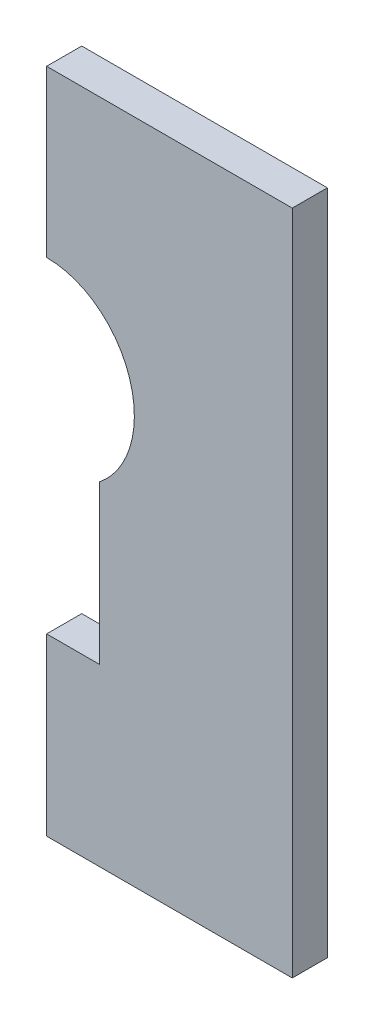
ISO-10303-21;
HEADER;
FILE_DESCRIPTION(('STEP AP214'),'2;1');
FILE_NAME('part.step','',(''),(''),'','','');
FILE_SCHEMA(('AUTOMOTIVE_DESIGN { 1 0 10303 214 1 1 1 1 }'));
ENDSEC;
DATA;
#1=APPLICATION_CONTEXT('core data for automotive mechanical design processes');
#2=APPLICATION_PROTOCOL_DEFINITION('international standard','automotive_design',2000,#1);
#3=PRODUCT_CONTEXT('',#1,'mechanical');
#4=PRODUCT('Part','Part','',(#3));
#5=PRODUCT_RELATED_PRODUCT_CATEGORY('part','',(#4));
#6=PRODUCT_DEFINITION_FORMATION('','',#4);
#7=PRODUCT_DEFINITION_CONTEXT('part definition',#1,'design');
#8=PRODUCT_DEFINITION('design','',#6,#7);
#9=PRODUCT_DEFINITION_SHAPE('','',#8);
#10=(LENGTH_UNIT() NAMED_UNIT(*) SI_UNIT(.MILLI.,.METRE.));
#11=(NAMED_UNIT(*) PLANE_ANGLE_UNIT() SI_UNIT($,.RADIAN.));
#12=(NAMED_UNIT(*) SI_UNIT($,.STERADIAN.) SOLID_ANGLE_UNIT());
#13=UNCERTAINTY_MEASURE_WITH_UNIT(LENGTH_MEASURE(1.E-05),#10,'distance_accuracy_value','');
#14=(GEOMETRIC_REPRESENTATION_CONTEXT(3) GLOBAL_UNCERTAINTY_ASSIGNED_CONTEXT((#13)) GLOBAL_UNIT_ASSIGNED_CONTEXT((#10,
#11,#12)) REPRESENTATION_CONTEXT('',''));
#15=CARTESIAN_POINT('',(0.,0.,0.));
#16=DIRECTION('',(0.,0.,1.));
#17=DIRECTION('',(1.,0.,0.));
#18=AXIS2_PLACEMENT_3D('',#15,#16,#17);
#19=CARTESIAN_POINT('',(0.,0.,10.));
#20=DIRECTION('',(1.,0.,0.));
#21=DIRECTION('',(0.,0.,-1.));
#22=AXIS2_PLACEMENT_3D('',#19,#20,#21);
#23=PLANE('',#22);
#24=DIRECTION('',(0.,-1.,0.));
#25=VECTOR('',#24,1.);
#26=CARTESIAN_POINT('',(0.,0.,10.));
#27=LINE('',#26,#25);
#28=CARTESIAN_POINT('',(0.,49.9232577921803,10.));
#29=VERTEX_POINT('',#28);
#30=CARTESIAN_POINT('',(0.,0.,10.));
#31=VERTEX_POINT('',#30);
#32=EDGE_CURVE('E130',#29,#31,#27,.T.);
#33=ORIENTED_EDGE('',*,*,#32,.F.);
#34=DIRECTION('',(0.,0.,-1.));
#35=VECTOR('',#34,1.);
#36=CARTESIAN_POINT('',(0.,49.9232577921803,10.));
#37=LINE('',#36,#35);
#38=CARTESIAN_POINT('',(0.,49.9232577921803,0.));
#39=VERTEX_POINT('',#38);
#40=EDGE_CURVE('E102',#29,#39,#37,.T.);
#41=ORIENTED_EDGE('',*,*,#40,.T.);
#42=DIRECTION('',(0.,-1.,0.));
#43=VECTOR('',#42,1.);
#44=CARTESIAN_POINT('',(0.,0.,0.));
#45=LINE('',#44,#43);
#46=CARTESIAN_POINT('',(0.,0.,0.));
#47=VERTEX_POINT('',#46);
#48=EDGE_CURVE('E140',#39,#47,#45,.T.);
#49=ORIENTED_EDGE('',*,*,#48,.T.);
#50=DIRECTION('',(0.,0.,-1.));
#51=VECTOR('',#50,1.);
#52=CARTESIAN_POINT('',(0.,0.,10.));
#53=LINE('',#52,#51);
#54=EDGE_CURVE('E147',#31,#47,#53,.T.);
#55=ORIENTED_EDGE('',*,*,#54,.F.);
#56=EDGE_LOOP('',(#33,#41,#49,#55));
#57=FACE_BOUND('',#56,.T.);
#58=ADVANCED_FACE('F32',(#57),#23,.F.);
#59=CARTESIAN_POINT('',(70.,0.,10.));
#60=DIRECTION('',(-1.,0.,0.));
#61=DIRECTION('',(0.,0.,1.));
#62=AXIS2_PLACEMENT_3D('',#59,#60,#61);
#63=PLANE('',#62);
#64=DIRECTION('',(0.,1.,0.));
#65=VECTOR('',#64,1.);
#66=CARTESIAN_POINT('',(70.,0.,0.));
#67=LINE('',#66,#65);
#68=CARTESIAN_POINT('',(70.,0.,0.));
#69=VERTEX_POINT('',#68);
#70=CARTESIAN_POINT('',(70.,190.,0.));
#71=VERTEX_POINT('',#70);
#72=EDGE_CURVE('E123',#69,#71,#67,.T.);
#73=ORIENTED_EDGE('',*,*,#72,.T.);
#74=DIRECTION('',(0.,0.,-1.));
#75=VECTOR('',#74,1.);
#76=CARTESIAN_POINT('',(70.,190.,10.));
#77=LINE('',#76,#75);
#78=CARTESIAN_POINT('',(70.,190.,10.));
#79=VERTEX_POINT('',#78);
#80=EDGE_CURVE('E153',#79,#71,#77,.T.);
#81=ORIENTED_EDGE('',*,*,#80,.F.);
#82=DIRECTION('',(0.,1.,0.));
#83=VECTOR('',#82,1.);
#84=CARTESIAN_POINT('',(70.,0.,10.));
#85=LINE('',#84,#83);
#86=CARTESIAN_POINT('',(70.,0.,10.));
#87=VERTEX_POINT('',#86);
#88=EDGE_CURVE('E124',#87,#79,#85,.T.);
#89=ORIENTED_EDGE('',*,*,#88,.F.);
#90=DIRECTION('',(0.,0.,-1.));
#91=VECTOR('',#90,1.);
#92=CARTESIAN_POINT('',(70.,0.,10.));
#93=LINE('',#92,#91);
#94=EDGE_CURVE('E135',#87,#69,#93,.T.);
#95=ORIENTED_EDGE('',*,*,#94,.T.);
#96=EDGE_LOOP('',(#73,#81,#89,#95));
#97=FACE_BOUND('',#96,.T.);
#98=ADVANCED_FACE('F34',(#97),#63,.F.);
#99=CARTESIAN_POINT('',(0.,190.,10.));
#100=DIRECTION('',(0.,-1.,0.));
#101=DIRECTION('',(0.,0.,-1.));
#102=AXIS2_PLACEMENT_3D('',#99,#100,#101);
#103=PLANE('',#102);
#104=DIRECTION('',(-1.,0.,0.));
#105=VECTOR('',#104,1.);
#106=CARTESIAN_POINT('',(0.,190.,0.));
#107=LINE('',#106,#105);
#108=CARTESIAN_POINT('',(0.,190.,0.));
#109=VERTEX_POINT('',#108);
#110=EDGE_CURVE('E138',#71,#109,#107,.T.);
#111=ORIENTED_EDGE('',*,*,#110,.T.);
#112=DIRECTION('',(0.,0.,-1.));
#113=VECTOR('',#112,1.);
#114=CARTESIAN_POINT('',(0.,190.,10.));
#115=LINE('',#114,#113);
#116=CARTESIAN_POINT('',(0.,190.,10.));
#117=VERTEX_POINT('',#116);
#118=EDGE_CURVE('E150',#117,#109,#115,.T.);
#119=ORIENTED_EDGE('',*,*,#118,.F.);
#120=DIRECTION('',(-1.,0.,0.));
#121=VECTOR('',#120,1.);
#122=CARTESIAN_POINT('',(0.,190.,10.));
#123=LINE('',#122,#121);
#124=EDGE_CURVE('E127',#79,#117,#123,.T.);
#125=ORIENTED_EDGE('',*,*,#124,.F.);
#126=ORIENTED_EDGE('',*,*,#80,.T.);
#127=EDGE_LOOP('',(#111,#119,#125,#126));
#128=FACE_BOUND('',#127,.T.);
#129=ADVANCED_FACE('F164',(#128),#103,.F.);
#130=CARTESIAN_POINT('',(0.,139.171555210934,0.));
#131=VERTEX_POINT('',#130);
#132=EDGE_CURVE('E141',#109,#131,#45,.T.);
#133=ORIENTED_EDGE('',*,*,#132,.T.);
#134=DIRECTION('',(0.,-0.342020143325669,-0.939692620785908));
#135=VECTOR('',#134,1.);
#136=CARTESIAN_POINT('',(0.,148.331291812378,25.1661694806188));
#137=LINE('',#136,#135);
#138=CARTESIAN_POINT('',(0.,142.811257553596,10.));
#139=VERTEX_POINT('',#138);
#140=EDGE_CURVE('E54',#139,#131,#137,.T.);
#141=ORIENTED_EDGE('',*,*,#140,.F.);
#142=EDGE_CURVE('E131',#117,#139,#27,.T.);
#143=ORIENTED_EDGE('',*,*,#142,.F.);
#144=ORIENTED_EDGE('',*,*,#118,.T.);
#145=EDGE_LOOP('',(#133,#141,#143,#144));
#146=FACE_BOUND('',#145,.T.);
#147=ADVANCED_FACE('F160',(#146),#23,.F.);
#148=CARTESIAN_POINT('',(0.,0.,10.));
#149=DIRECTION('',(0.,1.,0.));
#150=DIRECTION('',(0.,0.,1.));
#151=AXIS2_PLACEMENT_3D('',#148,#149,#150);
#152=PLANE('',#151);
#153=DIRECTION('',(1.,0.,0.));
#154=VECTOR('',#153,1.);
#155=CARTESIAN_POINT('',(0.,0.,0.));
#156=LINE('',#155,#154);
#157=EDGE_CURVE('E128',#47,#69,#156,.T.);
#158=ORIENTED_EDGE('',*,*,#157,.T.);
#159=ORIENTED_EDGE('',*,*,#94,.F.);
#160=DIRECTION('',(1.,0.,0.));
#161=VECTOR('',#160,1.);
#162=CARTESIAN_POINT('',(0.,0.,10.));
#163=LINE('',#162,#161);
#164=EDGE_CURVE('E133',#31,#87,#163,.T.);
#165=ORIENTED_EDGE('',*,*,#164,.F.);
#166=ORIENTED_EDGE('',*,*,#54,.T.);
#167=EDGE_LOOP('',(#158,#159,#165,#166));
#168=FACE_BOUND('',#167,.T.);
#169=ADVANCED_FACE('F174',(#168),#152,.F.);
#170=CARTESIAN_POINT('',(0.,0.,10.));
#171=DIRECTION('',(0.,0.,-1.));
#172=DIRECTION('',(-1.,0.,0.));
#173=AXIS2_PLACEMENT_3D('',#170,#171,#172);
#174=PLANE('',#173);
#175=DIRECTION('',(0.,-1.,0.));
#176=VECTOR('',#175,1.);
#177=CARTESIAN_POINT('',(15.,49.9232577921803,10.));
#178=LINE('',#177,#176);
#179=CARTESIAN_POINT('',(15.,94.9232577921803,10.));
#180=VERTEX_POINT('',#179);
#181=CARTESIAN_POINT('',(15.,49.9232577921803,10.));
#182=VERTEX_POINT('',#181);
#183=EDGE_CURVE('E47',#180,#182,#178,.T.);
#184=ORIENTED_EDGE('',*,*,#183,.T.);
#185=DIRECTION('',(-1.,0.,0.));
#186=VECTOR('',#185,1.);
#187=CARTESIAN_POINT('',(0.,49.9232577921803,10.));
#188=LINE('',#187,#186);
#189=EDGE_CURVE('E103',#182,#29,#188,.T.);
#190=ORIENTED_EDGE('',*,*,#189,.T.);
#191=ORIENTED_EDGE('',*,*,#32,.T.);
#192=ORIENTED_EDGE('',*,*,#164,.T.);
#193=ORIENTED_EDGE('',*,*,#88,.T.);
#194=ORIENTED_EDGE('',*,*,#124,.T.);
#195=ORIENTED_EDGE('',*,*,#142,.T.);
#196=CARTESIAN_POINT('',(0.,116.206813241699,10.));
#197=DIRECTION('',(0.,0.,-1.));
#198=DIRECTION('',(0.,-1.,0.));
#199=AXIS2_PLACEMENT_3D('',#196,#197,#198);
#200=ELLIPSE('',#199,26.6044443118978,25.);
#201=EDGE_CURVE('E114',#139,#180,#200,.T.);
#202=ORIENTED_EDGE('',*,*,#201,.T.);
#203=EDGE_LOOP('',(#184,#190,#191,#192,#193,#194,#195,#202));
#204=FACE_BOUND('',#203,.T.);
#205=ADVANCED_FACE('F112',(#204),#174,.F.);
#206=CARTESIAN_POINT('',(0.,0.,0.));
#207=DIRECTION('',(0.,0.,-1.));
#208=DIRECTION('',(-1.,0.,0.));
#209=AXIS2_PLACEMENT_3D('',#206,#207,#208);
#210=PLANE('',#209);
#211=DIRECTION('',(-1.,0.,0.));
#212=VECTOR('',#211,1.);
#213=CARTESIAN_POINT('',(0.,49.9232577921803,0.));
#214=LINE('',#213,#212);
#215=CARTESIAN_POINT('',(15.,49.9232577921803,0.));
#216=VERTEX_POINT('',#215);
#217=EDGE_CURVE('E115',#216,#39,#214,.T.);
#218=ORIENTED_EDGE('',*,*,#217,.F.);
#219=DIRECTION('',(0.,-1.,0.));
#220=VECTOR('',#219,1.);
#221=CARTESIAN_POINT('',(15.,49.9232577921803,0.));
#222=LINE('',#221,#220);
#223=CARTESIAN_POINT('',(15.,91.2835554495182,0.));
#224=VERTEX_POINT('',#223);
#225=EDGE_CURVE('E99',#224,#216,#222,.T.);
#226=ORIENTED_EDGE('',*,*,#225,.F.);
#227=CARTESIAN_POINT('',(0.,112.567110899036,0.));
#228=DIRECTION('',(0.,0.,-1.));
#229=DIRECTION('',(0.,-1.,0.));
#230=AXIS2_PLACEMENT_3D('',#227,#228,#229);
#231=ELLIPSE('',#230,26.6044443118978,25.);
#232=EDGE_CURVE('E40',#131,#224,#231,.T.);
#233=ORIENTED_EDGE('',*,*,#232,.F.);
#234=ORIENTED_EDGE('',*,*,#132,.F.);
#235=ORIENTED_EDGE('',*,*,#110,.F.);
#236=ORIENTED_EDGE('',*,*,#72,.F.);
#237=ORIENTED_EDGE('',*,*,#157,.F.);
#238=ORIENTED_EDGE('',*,*,#48,.F.);
#239=EDGE_LOOP('',(#218,#226,#233,#234,#235,#236,#237,#238));
#240=FACE_BOUND('',#239,.T.);
#241=ADVANCED_FACE('F158',(#240),#210,.T.);
#242=CARTESIAN_POINT('',(0.,124.83897629273,33.7166730637605));
#243=DIRECTION('',(0.,-0.342020143325669,-0.939692620785908));
#244=DIRECTION('',(0.,0.939692620785908,-0.342020143325669));
#245=AXIS2_PLACEMENT_3D('',#242,#243,#244);
#246=CYLINDRICAL_SURFACE('',#245,25.);
#247=ORIENTED_EDGE('',*,*,#232,.T.);
#248=DIRECTION('',(0.,-0.342020143325669,-0.939692620785908));
#249=VECTOR('',#248,1.);
#250=CARTESIAN_POINT('',(15.,106.045123877012,40.5570759302739));
#251=LINE('',#250,#249);
#252=EDGE_CURVE('E11',#224,#180,#251,.F.);
#253=ORIENTED_EDGE('',*,*,#252,.T.);
#254=ORIENTED_EDGE('',*,*,#201,.F.);
#255=ORIENTED_EDGE('',*,*,#140,.T.);
#256=EDGE_LOOP('',(#247,#253,#254,#255));
#257=FACE_BOUND('',#256,.T.);
#258=ADVANCED_FACE('F155',(#257),#246,.F.);
#259=CARTESIAN_POINT('',(15.,49.9232577921803,10.));
#260=DIRECTION('',(1.,0.,0.));
#261=DIRECTION('',(0.,1.,0.));
#262=AXIS2_PLACEMENT_3D('',#259,#260,#261);
#263=PLANE('',#262);
#264=ORIENTED_EDGE('',*,*,#225,.T.);
#265=DIRECTION('',(0.,0.,-1.));
#266=VECTOR('',#265,1.);
#267=CARTESIAN_POINT('',(15.,49.9232577921803,10.));
#268=LINE('',#267,#266);
#269=EDGE_CURVE('E95',#182,#216,#268,.T.);
#270=ORIENTED_EDGE('',*,*,#269,.F.);
#271=ORIENTED_EDGE('',*,*,#183,.F.);
#272=ORIENTED_EDGE('',*,*,#252,.F.);
#273=EDGE_LOOP('',(#264,#270,#271,#272));
#274=FACE_BOUND('',#273,.T.);
#275=ADVANCED_FACE('F97',(#274),#263,.F.);
#276=CARTESIAN_POINT('',(0.,49.9232577921803,10.));
#277=DIRECTION('',(0.,-1.,0.));
#278=DIRECTION('',(0.,0.,-1.));
#279=AXIS2_PLACEMENT_3D('',#276,#277,#278);
#280=PLANE('',#279);
#281=ORIENTED_EDGE('',*,*,#217,.T.);
#282=ORIENTED_EDGE('',*,*,#40,.F.);
#283=ORIENTED_EDGE('',*,*,#189,.F.);
#284=ORIENTED_EDGE('',*,*,#269,.T.);
#285=EDGE_LOOP('',(#281,#282,#283,#284));
#286=FACE_BOUND('',#285,.T.);
#287=ADVANCED_FACE('F106',(#286),#280,.F.);
#288=CLOSED_SHELL('',(#58,#98,#129,#147,#169,#205,#241,#258,#275,#287));
#289=MANIFOLD_SOLID_BREP('B2',#288);
#290=ADVANCED_BREP_SHAPE_REPRESENTATION('',(#18,#289),#14);
#291=SHAPE_DEFINITION_REPRESENTATION(#9,#290);
ENDSEC;
END-ISO-10303-21;
